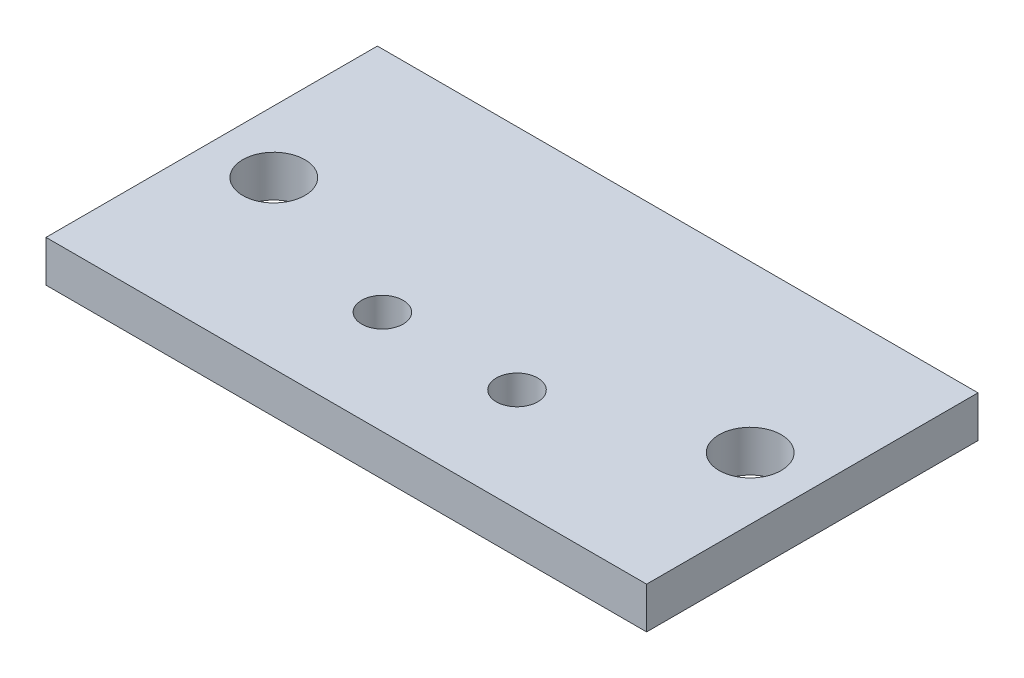
ISO-10303-21;
HEADER;
FILE_DESCRIPTION(('STEP AP214'),'2;1');
FILE_NAME('part.step','',(''),(''),'','','');
FILE_SCHEMA(('AUTOMOTIVE_DESIGN { 1 0 10303 214 1 1 1 1 }'));
ENDSEC;
DATA;
#1=APPLICATION_CONTEXT('core data for automotive mechanical design processes');
#2=APPLICATION_PROTOCOL_DEFINITION('international standard','automotive_design',2000,#1);
#3=PRODUCT_CONTEXT('',#1,'mechanical');
#4=PRODUCT('Part','Part','',(#3));
#5=PRODUCT_RELATED_PRODUCT_CATEGORY('part','',(#4));
#6=PRODUCT_DEFINITION_FORMATION('','',#4);
#7=PRODUCT_DEFINITION_CONTEXT('part definition',#1,'design');
#8=PRODUCT_DEFINITION('design','',#6,#7);
#9=PRODUCT_DEFINITION_SHAPE('','',#8);
#10=(LENGTH_UNIT() NAMED_UNIT(*) SI_UNIT(.MILLI.,.METRE.));
#11=(NAMED_UNIT(*) PLANE_ANGLE_UNIT() SI_UNIT($,.RADIAN.));
#12=(NAMED_UNIT(*) SI_UNIT($,.STERADIAN.) SOLID_ANGLE_UNIT());
#13=UNCERTAINTY_MEASURE_WITH_UNIT(LENGTH_MEASURE(1.E-05),#10,'distance_accuracy_value','');
#14=(GEOMETRIC_REPRESENTATION_CONTEXT(3) GLOBAL_UNCERTAINTY_ASSIGNED_CONTEXT((#13)) GLOBAL_UNIT_ASSIGNED_CONTEXT((#10,
#11,#12)) REPRESENTATION_CONTEXT('',''));
#15=CARTESIAN_POINT('',(0.,0.,0.));
#16=DIRECTION('',(0.,0.,1.));
#17=DIRECTION('',(1.,0.,0.));
#18=AXIS2_PLACEMENT_3D('',#15,#16,#17);
#19=CARTESIAN_POINT('',(0.,2.,0.));
#20=DIRECTION('',(0.,1.,0.));
#21=DIRECTION('',(0.,0.,1.));
#22=AXIS2_PLACEMENT_3D('',#19,#20,#21);
#23=PLANE('',#22);
#24=CARTESIAN_POINT('',(-3.25,2.,3.00774876620858));
#25=DIRECTION('',(0.,1.,0.));
#26=DIRECTION('',(0.,0.,1.));
#27=AXIS2_PLACEMENT_3D('',#24,#25,#26);
#28=CIRCLE('',#27,1.);
#29=CARTESIAN_POINT('',(-3.25,2.,4.00774876620858));
#30=VERTEX_POINT('',#29);
#31=EDGE_CURVE('E127',#30,#30,#28,.T.);
#32=ORIENTED_EDGE('',*,*,#31,.F.);
#33=EDGE_LOOP('',(#32));
#34=FACE_BOUND('',#33,.T.);
#35=CARTESIAN_POINT('',(11.5,2.,0.));
#36=DIRECTION('',(0.,1.,0.));
#37=DIRECTION('',(0.,0.,1.));
#38=AXIS2_PLACEMENT_3D('',#35,#36,#37);
#39=CIRCLE('',#38,1.5);
#40=CARTESIAN_POINT('',(11.5,2.,1.5));
#41=VERTEX_POINT('',#40);
#42=EDGE_CURVE('E106',#41,#41,#39,.T.);
#43=ORIENTED_EDGE('',*,*,#42,.F.);
#44=EDGE_LOOP('',(#43));
#45=FACE_BOUND('',#44,.T.);
#46=DIRECTION('',(0.,0.,1.));
#47=VECTOR('',#46,1.);
#48=CARTESIAN_POINT('',(-14.5,2.,8.));
#49=LINE('',#48,#47);
#50=CARTESIAN_POINT('',(-14.5,2.,-8.));
#51=VERTEX_POINT('',#50);
#52=CARTESIAN_POINT('',(-14.5,2.,8.));
#53=VERTEX_POINT('',#52);
#54=EDGE_CURVE('E91',#51,#53,#49,.T.);
#55=ORIENTED_EDGE('',*,*,#54,.T.);
#56=DIRECTION('',(1.,0.,0.));
#57=VECTOR('',#56,1.);
#58=CARTESIAN_POINT('',(-14.5,2.,8.));
#59=LINE('',#58,#57);
#60=CARTESIAN_POINT('',(14.5,2.,8.));
#61=VERTEX_POINT('',#60);
#62=EDGE_CURVE('E86',#53,#61,#59,.T.);
#63=ORIENTED_EDGE('',*,*,#62,.T.);
#64=DIRECTION('',(0.,0.,-1.));
#65=VECTOR('',#64,1.);
#66=CARTESIAN_POINT('',(14.5,2.,8.));
#67=LINE('',#66,#65);
#68=CARTESIAN_POINT('',(14.5,2.,-8.));
#69=VERTEX_POINT('',#68);
#70=EDGE_CURVE('E89',#61,#69,#67,.T.);
#71=ORIENTED_EDGE('',*,*,#70,.T.);
#72=DIRECTION('',(-1.,0.,0.));
#73=VECTOR('',#72,1.);
#74=CARTESIAN_POINT('',(14.5,2.,-8.));
#75=LINE('',#74,#73);
#76=EDGE_CURVE('E56',#69,#51,#75,.T.);
#77=ORIENTED_EDGE('',*,*,#76,.T.);
#78=EDGE_LOOP('',(#55,#63,#71,#77));
#79=FACE_BOUND('',#78,.T.);
#80=CARTESIAN_POINT('',(-11.5,2.,0.));
#81=DIRECTION('',(0.,1.,0.));
#82=DIRECTION('',(0.,0.,-1.));
#83=AXIS2_PLACEMENT_3D('',#80,#81,#82);
#84=CIRCLE('',#83,1.5);
#85=CARTESIAN_POINT('',(-11.5,2.,-1.5));
#86=VERTEX_POINT('',#85);
#87=EDGE_CURVE('E121',#86,#86,#84,.T.);
#88=ORIENTED_EDGE('',*,*,#87,.F.);
#89=EDGE_LOOP('',(#88));
#90=FACE_BOUND('',#89,.T.);
#91=CARTESIAN_POINT('',(3.25000000000001,2.,3.00774876620858));
#92=DIRECTION('',(0.,1.,0.));
#93=DIRECTION('',(0.,0.,-1.));
#94=AXIS2_PLACEMENT_3D('',#91,#92,#93);
#95=CIRCLE('',#94,1.);
#96=CARTESIAN_POINT('',(3.25000000000001,2.,2.00774876620858));
#97=VERTEX_POINT('',#96);
#98=EDGE_CURVE('E133',#97,#97,#95,.T.);
#99=ORIENTED_EDGE('',*,*,#98,.F.);
#100=EDGE_LOOP('',(#99));
#101=FACE_BOUND('',#100,.T.);
#102=ADVANCED_FACE('F39',(#34,#45,#79,#90,#101),#23,.T.);
#103=CARTESIAN_POINT('',(0.,0.,0.));
#104=DIRECTION('',(0.,1.,0.));
#105=DIRECTION('',(0.,0.,1.));
#106=AXIS2_PLACEMENT_3D('',#103,#104,#105);
#107=PLANE('',#106);
#108=DIRECTION('',(0.,0.,1.));
#109=VECTOR('',#108,1.);
#110=CARTESIAN_POINT('',(-14.5,0.,8.));
#111=LINE('',#110,#109);
#112=CARTESIAN_POINT('',(-14.5,0.,-8.));
#113=VERTEX_POINT('',#112);
#114=CARTESIAN_POINT('',(-14.5,0.,8.));
#115=VERTEX_POINT('',#114);
#116=EDGE_CURVE('E103',#113,#115,#111,.T.);
#117=ORIENTED_EDGE('',*,*,#116,.F.);
#118=DIRECTION('',(-1.,0.,0.));
#119=VECTOR('',#118,1.);
#120=CARTESIAN_POINT('',(14.5,0.,-8.));
#121=LINE('',#120,#119);
#122=CARTESIAN_POINT('',(14.5,0.,-8.));
#123=VERTEX_POINT('',#122);
#124=EDGE_CURVE('E79',#123,#113,#121,.T.);
#125=ORIENTED_EDGE('',*,*,#124,.F.);
#126=DIRECTION('',(0.,0.,-1.));
#127=VECTOR('',#126,1.);
#128=CARTESIAN_POINT('',(14.5,0.,8.));
#129=LINE('',#128,#127);
#130=CARTESIAN_POINT('',(14.5,0.,8.));
#131=VERTEX_POINT('',#130);
#132=EDGE_CURVE('E73',#131,#123,#129,.T.);
#133=ORIENTED_EDGE('',*,*,#132,.F.);
#134=DIRECTION('',(1.,0.,0.));
#135=VECTOR('',#134,1.);
#136=CARTESIAN_POINT('',(-14.5,0.,8.));
#137=LINE('',#136,#135);
#138=EDGE_CURVE('E95',#115,#131,#137,.T.);
#139=ORIENTED_EDGE('',*,*,#138,.F.);
#140=EDGE_LOOP('',(#117,#125,#133,#139));
#141=FACE_BOUND('',#140,.T.);
#142=CARTESIAN_POINT('',(11.5,0.,0.));
#143=DIRECTION('',(0.,1.,0.));
#144=DIRECTION('',(0.,0.,1.));
#145=AXIS2_PLACEMENT_3D('',#142,#143,#144);
#146=CIRCLE('',#145,1.5);
#147=CARTESIAN_POINT('',(11.5,0.,1.5));
#148=VERTEX_POINT('',#147);
#149=EDGE_CURVE('E118',#148,#148,#146,.T.);
#150=ORIENTED_EDGE('',*,*,#149,.T.);
#151=EDGE_LOOP('',(#150));
#152=FACE_BOUND('',#151,.T.);
#153=CARTESIAN_POINT('',(-11.5,0.,0.));
#154=DIRECTION('',(0.,1.,0.));
#155=DIRECTION('',(0.,0.,-1.));
#156=AXIS2_PLACEMENT_3D('',#153,#154,#155);
#157=CIRCLE('',#156,1.5);
#158=CARTESIAN_POINT('',(-11.5,0.,-1.5));
#159=VERTEX_POINT('',#158);
#160=EDGE_CURVE('E124',#159,#159,#157,.T.);
#161=ORIENTED_EDGE('',*,*,#160,.T.);
#162=EDGE_LOOP('',(#161));
#163=FACE_BOUND('',#162,.T.);
#164=CARTESIAN_POINT('',(-3.25,0.,3.00774876620858));
#165=DIRECTION('',(0.,1.,0.));
#166=DIRECTION('',(0.,0.,1.));
#167=AXIS2_PLACEMENT_3D('',#164,#165,#166);
#168=CIRCLE('',#167,1.);
#169=CARTESIAN_POINT('',(-3.25,0.,4.00774876620858));
#170=VERTEX_POINT('',#169);
#171=EDGE_CURVE('E130',#170,#170,#168,.T.);
#172=ORIENTED_EDGE('',*,*,#171,.T.);
#173=EDGE_LOOP('',(#172));
#174=FACE_BOUND('',#173,.T.);
#175=CARTESIAN_POINT('',(3.25000000000001,0.,3.00774876620858));
#176=DIRECTION('',(0.,1.,0.));
#177=DIRECTION('',(0.,0.,-1.));
#178=AXIS2_PLACEMENT_3D('',#175,#176,#177);
#179=CIRCLE('',#178,1.);
#180=CARTESIAN_POINT('',(3.25000000000001,0.,2.00774876620858));
#181=VERTEX_POINT('',#180);
#182=EDGE_CURVE('E136',#181,#181,#179,.T.);
#183=ORIENTED_EDGE('',*,*,#182,.T.);
#184=EDGE_LOOP('',(#183));
#185=FACE_BOUND('',#184,.T.);
#186=ADVANCED_FACE('F114',(#141,#152,#163,#174,#185),#107,.F.);
#187=CARTESIAN_POINT('',(-14.5,2.,8.));
#188=DIRECTION('',(1.,0.,0.));
#189=DIRECTION('',(0.,0.,-1.));
#190=AXIS2_PLACEMENT_3D('',#187,#188,#189);
#191=PLANE('',#190);
#192=ORIENTED_EDGE('',*,*,#116,.T.);
#193=DIRECTION('',(0.,-1.,0.));
#194=VECTOR('',#193,1.);
#195=CARTESIAN_POINT('',(-14.5,2.,8.));
#196=LINE('',#195,#194);
#197=EDGE_CURVE('E11',#53,#115,#196,.T.);
#198=ORIENTED_EDGE('',*,*,#197,.F.);
#199=ORIENTED_EDGE('',*,*,#54,.F.);
#200=DIRECTION('',(0.,-1.,0.));
#201=VECTOR('',#200,1.);
#202=CARTESIAN_POINT('',(-14.5,2.,-8.));
#203=LINE('',#202,#201);
#204=EDGE_CURVE('E99',#51,#113,#203,.T.);
#205=ORIENTED_EDGE('',*,*,#204,.T.);
#206=EDGE_LOOP('',(#192,#198,#199,#205));
#207=FACE_BOUND('',#206,.T.);
#208=ADVANCED_FACE('F41',(#207),#191,.F.);
#209=CARTESIAN_POINT('',(-14.5,2.,8.));
#210=DIRECTION('',(0.,0.,-1.));
#211=DIRECTION('',(-1.,0.,0.));
#212=AXIS2_PLACEMENT_3D('',#209,#210,#211);
#213=PLANE('',#212);
#214=ORIENTED_EDGE('',*,*,#138,.T.);
#215=DIRECTION('',(0.,-1.,0.));
#216=VECTOR('',#215,1.);
#217=CARTESIAN_POINT('',(14.5,2.,8.));
#218=LINE('',#217,#216);
#219=EDGE_CURVE('E48',#61,#131,#218,.T.);
#220=ORIENTED_EDGE('',*,*,#219,.F.);
#221=ORIENTED_EDGE('',*,*,#62,.F.);
#222=ORIENTED_EDGE('',*,*,#197,.T.);
#223=EDGE_LOOP('',(#214,#220,#221,#222));
#224=FACE_BOUND('',#223,.T.);
#225=ADVANCED_FACE('F94',(#224),#213,.F.);
#226=CARTESIAN_POINT('',(14.5,2.,8.));
#227=DIRECTION('',(-1.,0.,0.));
#228=DIRECTION('',(0.,0.,1.));
#229=AXIS2_PLACEMENT_3D('',#226,#227,#228);
#230=PLANE('',#229);
#231=ORIENTED_EDGE('',*,*,#132,.T.);
#232=DIRECTION('',(0.,-1.,0.));
#233=VECTOR('',#232,1.);
#234=CARTESIAN_POINT('',(14.5,2.,-8.));
#235=LINE('',#234,#233);
#236=EDGE_CURVE('E96',#69,#123,#235,.T.);
#237=ORIENTED_EDGE('',*,*,#236,.F.);
#238=ORIENTED_EDGE('',*,*,#70,.F.);
#239=ORIENTED_EDGE('',*,*,#219,.T.);
#240=EDGE_LOOP('',(#231,#237,#238,#239));
#241=FACE_BOUND('',#240,.T.);
#242=ADVANCED_FACE('F97',(#241),#230,.F.);
#243=CARTESIAN_POINT('',(14.5,2.,-8.));
#244=DIRECTION('',(0.,0.,1.));
#245=DIRECTION('',(1.,0.,0.));
#246=AXIS2_PLACEMENT_3D('',#243,#244,#245);
#247=PLANE('',#246);
#248=ORIENTED_EDGE('',*,*,#124,.T.);
#249=ORIENTED_EDGE('',*,*,#204,.F.);
#250=ORIENTED_EDGE('',*,*,#76,.F.);
#251=ORIENTED_EDGE('',*,*,#236,.T.);
#252=EDGE_LOOP('',(#248,#249,#250,#251));
#253=FACE_BOUND('',#252,.T.);
#254=ADVANCED_FACE('F111',(#253),#247,.F.);
#255=CARTESIAN_POINT('',(11.5,2.,0.));
#256=DIRECTION('',(0.,-1.,0.));
#257=DIRECTION('',(0.,0.,-1.));
#258=AXIS2_PLACEMENT_3D('',#255,#256,#257);
#259=CYLINDRICAL_SURFACE('',#258,1.5);
#260=ORIENTED_EDGE('',*,*,#42,.T.);
#261=EDGE_LOOP('',(#260));
#262=FACE_BOUND('',#261,.T.);
#263=ORIENTED_EDGE('',*,*,#149,.F.);
#264=EDGE_LOOP('',(#263));
#265=FACE_BOUND('',#264,.T.);
#266=ADVANCED_FACE('F155',(#262,#265),#259,.F.);
#267=CARTESIAN_POINT('',(-11.5,2.,0.));
#268=DIRECTION('',(0.,-1.,0.));
#269=DIRECTION('',(0.,0.,-1.));
#270=AXIS2_PLACEMENT_3D('',#267,#268,#269);
#271=CYLINDRICAL_SURFACE('',#270,1.5);
#272=ORIENTED_EDGE('',*,*,#87,.T.);
#273=EDGE_LOOP('',(#272));
#274=FACE_BOUND('',#273,.T.);
#275=ORIENTED_EDGE('',*,*,#160,.F.);
#276=EDGE_LOOP('',(#275));
#277=FACE_BOUND('',#276,.T.);
#278=ADVANCED_FACE('F200',(#274,#277),#271,.F.);
#279=CARTESIAN_POINT('',(-3.25,2.,3.00774876620858));
#280=DIRECTION('',(0.,-1.,0.));
#281=DIRECTION('',(0.,0.,-1.));
#282=AXIS2_PLACEMENT_3D('',#279,#280,#281);
#283=CYLINDRICAL_SURFACE('',#282,1.);
#284=ORIENTED_EDGE('',*,*,#31,.T.);
#285=EDGE_LOOP('',(#284));
#286=FACE_BOUND('',#285,.T.);
#287=ORIENTED_EDGE('',*,*,#171,.F.);
#288=EDGE_LOOP('',(#287));
#289=FACE_BOUND('',#288,.T.);
#290=ADVANCED_FACE('F208',(#286,#289),#283,.F.);
#291=CARTESIAN_POINT('',(3.25000000000001,2.,3.00774876620858));
#292=DIRECTION('',(0.,-1.,0.));
#293=DIRECTION('',(0.,0.,-1.));
#294=AXIS2_PLACEMENT_3D('',#291,#292,#293);
#295=CYLINDRICAL_SURFACE('',#294,1.);
#296=ORIENTED_EDGE('',*,*,#98,.T.);
#297=EDGE_LOOP('',(#296));
#298=FACE_BOUND('',#297,.T.);
#299=ORIENTED_EDGE('',*,*,#182,.F.);
#300=EDGE_LOOP('',(#299));
#301=FACE_BOUND('',#300,.T.);
#302=ADVANCED_FACE('F142',(#298,#301),#295,.F.);
#303=CLOSED_SHELL('',(#102,#186,#208,#225,#242,#254,#266,#278,#290,#302));
#304=MANIFOLD_SOLID_BREP('B2',#303);
#305=ADVANCED_BREP_SHAPE_REPRESENTATION('',(#18,#304),#14);
#306=SHAPE_DEFINITION_REPRESENTATION(#9,#305);
ENDSEC;
END-ISO-10303-21;
